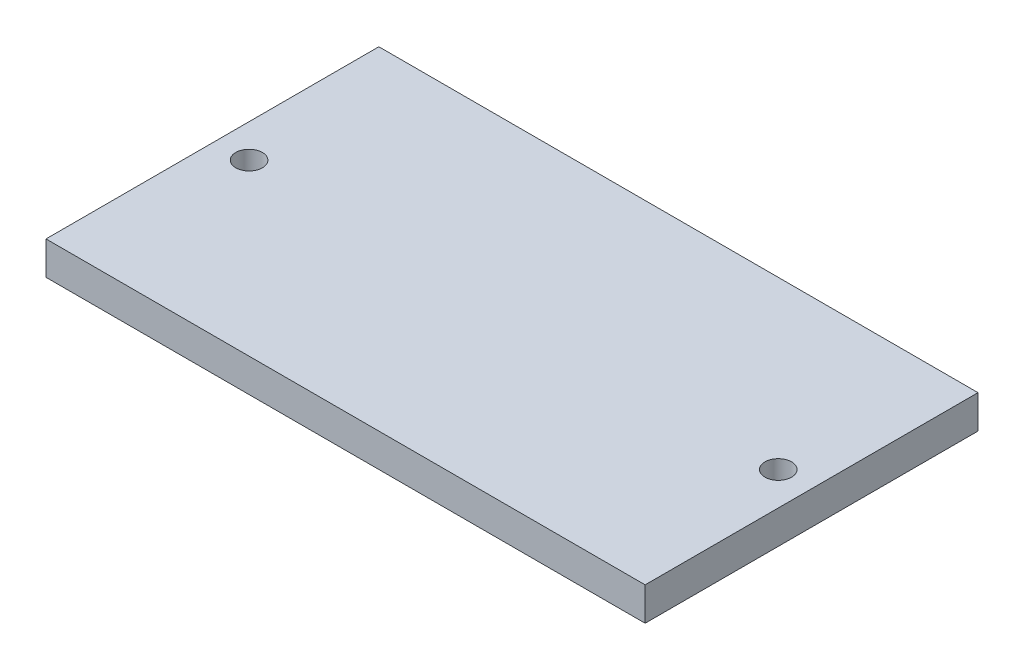
ISO-10303-21;
HEADER;
FILE_DESCRIPTION(('STEP AP214'),'2;1');
FILE_NAME('part.step','',(''),(''),'','','');
FILE_SCHEMA(('AUTOMOTIVE_DESIGN { 1 0 10303 214 1 1 1 1 }'));
ENDSEC;
DATA;
#1=APPLICATION_CONTEXT('core data for automotive mechanical design processes');
#2=APPLICATION_PROTOCOL_DEFINITION('international standard','automotive_design',2000,#1);
#3=PRODUCT_CONTEXT('',#1,'mechanical');
#4=PRODUCT('Part','Part','',(#3));
#5=PRODUCT_RELATED_PRODUCT_CATEGORY('part','',(#4));
#6=PRODUCT_DEFINITION_FORMATION('','',#4);
#7=PRODUCT_DEFINITION_CONTEXT('part definition',#1,'design');
#8=PRODUCT_DEFINITION('design','',#6,#7);
#9=PRODUCT_DEFINITION_SHAPE('','',#8);
#10=(LENGTH_UNIT() NAMED_UNIT(*) SI_UNIT(.MILLI.,.METRE.));
#11=(NAMED_UNIT(*) PLANE_ANGLE_UNIT() SI_UNIT($,.RADIAN.));
#12=(NAMED_UNIT(*) SI_UNIT($,.STERADIAN.) SOLID_ANGLE_UNIT());
#13=UNCERTAINTY_MEASURE_WITH_UNIT(LENGTH_MEASURE(1.E-05),#10,'distance_accuracy_value','');
#14=(GEOMETRIC_REPRESENTATION_CONTEXT(3) GLOBAL_UNCERTAINTY_ASSIGNED_CONTEXT((#13)) GLOBAL_UNIT_ASSIGNED_CONTEXT((#10,
#11,#12)) REPRESENTATION_CONTEXT('',''));
#15=CARTESIAN_POINT('',(0.,0.,0.));
#16=DIRECTION('',(0.,0.,1.));
#17=DIRECTION('',(1.,0.,0.));
#18=AXIS2_PLACEMENT_3D('',#15,#16,#17);
#19=CARTESIAN_POINT('',(0.,5.,0.));
#20=DIRECTION('',(0.,1.,0.));
#21=DIRECTION('',(0.,0.,1.));
#22=AXIS2_PLACEMENT_3D('',#19,#20,#21);
#23=PLANE('',#22);
#24=CARTESIAN_POINT('',(-39.9968748779201,5.,-0.499999999999985));
#25=DIRECTION('',(0.,1.,0.));
#26=DIRECTION('',(0.,0.,1.));
#27=AXIS2_PLACEMENT_3D('',#24,#25,#26);
#28=CIRCLE('',#27,2.);
#29=CARTESIAN_POINT('',(-39.9968748779201,5.,1.50000000000002));
#30=VERTEX_POINT('',#29);
#31=EDGE_CURVE('E112',#30,#30,#28,.T.);
#32=ORIENTED_EDGE('',*,*,#31,.F.);
#33=EDGE_LOOP('',(#32));
#34=FACE_BOUND('',#33,.T.);
#35=DIRECTION('',(0.,0.,1.));
#36=VECTOR('',#35,1.);
#37=CARTESIAN_POINT('',(-45.,5.,25.));
#38=LINE('',#37,#36);
#39=CARTESIAN_POINT('',(-45.,5.,-25.));
#40=VERTEX_POINT('',#39);
#41=CARTESIAN_POINT('',(-45.,5.,25.));
#42=VERTEX_POINT('',#41);
#43=EDGE_CURVE('E92',#40,#42,#38,.T.);
#44=ORIENTED_EDGE('',*,*,#43,.T.);
#45=DIRECTION('',(1.,0.,0.));
#46=VECTOR('',#45,1.);
#47=CARTESIAN_POINT('',(45.,5.,25.));
#48=LINE('',#47,#46);
#49=CARTESIAN_POINT('',(45.,5.,25.));
#50=VERTEX_POINT('',#49);
#51=EDGE_CURVE('E87',#42,#50,#48,.T.);
#52=ORIENTED_EDGE('',*,*,#51,.T.);
#53=DIRECTION('',(0.,0.,-1.));
#54=VECTOR('',#53,1.);
#55=CARTESIAN_POINT('',(45.,5.,25.));
#56=LINE('',#55,#54);
#57=CARTESIAN_POINT('',(45.,5.,-25.));
#58=VERTEX_POINT('',#57);
#59=EDGE_CURVE('E90',#50,#58,#56,.T.);
#60=ORIENTED_EDGE('',*,*,#59,.T.);
#61=DIRECTION('',(-1.,0.,0.));
#62=VECTOR('',#61,1.);
#63=CARTESIAN_POINT('',(45.,5.,-25.));
#64=LINE('',#63,#62);
#65=EDGE_CURVE('E57',#58,#40,#64,.T.);
#66=ORIENTED_EDGE('',*,*,#65,.T.);
#67=EDGE_LOOP('',(#44,#52,#60,#66));
#68=FACE_BOUND('',#67,.T.);
#69=CARTESIAN_POINT('',(40.,5.,0.));
#70=DIRECTION('',(0.,1.,0.));
#71=DIRECTION('',(0.,0.,1.));
#72=AXIS2_PLACEMENT_3D('',#69,#70,#71);
#73=CIRCLE('',#72,2.);
#74=CARTESIAN_POINT('',(40.,5.,2.));
#75=VERTEX_POINT('',#74);
#76=EDGE_CURVE('E134',#75,#75,#73,.T.);
#77=ORIENTED_EDGE('',*,*,#76,.F.);
#78=EDGE_LOOP('',(#77));
#79=FACE_BOUND('',#78,.T.);
#80=ADVANCED_FACE('F39',(#34,#68,#79),#23,.T.);
#81=CARTESIAN_POINT('',(0.,0.,0.));
#82=DIRECTION('',(0.,1.,0.));
#83=DIRECTION('',(0.,0.,1.));
#84=AXIS2_PLACEMENT_3D('',#81,#82,#83);
#85=PLANE('',#84);
#86=DIRECTION('',(0.,0.,1.));
#87=VECTOR('',#86,1.);
#88=CARTESIAN_POINT('',(-45.,0.,25.));
#89=LINE('',#88,#87);
#90=CARTESIAN_POINT('',(-45.,0.,-25.));
#91=VERTEX_POINT('',#90);
#92=CARTESIAN_POINT('',(-45.,0.,25.));
#93=VERTEX_POINT('',#92);
#94=EDGE_CURVE('E108',#91,#93,#89,.T.);
#95=ORIENTED_EDGE('',*,*,#94,.F.);
#96=DIRECTION('',(-1.,0.,0.));
#97=VECTOR('',#96,1.);
#98=CARTESIAN_POINT('',(45.,0.,-25.));
#99=LINE('',#98,#97);
#100=CARTESIAN_POINT('',(45.,0.,-25.));
#101=VERTEX_POINT('',#100);
#102=EDGE_CURVE('E80',#101,#91,#99,.T.);
#103=ORIENTED_EDGE('',*,*,#102,.F.);
#104=DIRECTION('',(0.,0.,-1.));
#105=VECTOR('',#104,1.);
#106=CARTESIAN_POINT('',(45.,0.,25.));
#107=LINE('',#106,#105);
#108=CARTESIAN_POINT('',(45.,0.,25.));
#109=VERTEX_POINT('',#108);
#110=EDGE_CURVE('E74',#109,#101,#107,.T.);
#111=ORIENTED_EDGE('',*,*,#110,.F.);
#112=DIRECTION('',(1.,0.,0.));
#113=VECTOR('',#112,1.);
#114=CARTESIAN_POINT('',(45.,0.,25.));
#115=LINE('',#114,#113);
#116=EDGE_CURVE('E97',#93,#109,#115,.T.);
#117=ORIENTED_EDGE('',*,*,#116,.F.);
#118=EDGE_LOOP('',(#95,#103,#111,#117));
#119=FACE_BOUND('',#118,.T.);
#120=CARTESIAN_POINT('',(-39.9968748779201,0.,-0.499999999999985));
#121=DIRECTION('',(0.,1.,0.));
#122=DIRECTION('',(0.,0.,1.));
#123=AXIS2_PLACEMENT_3D('',#120,#121,#122);
#124=CIRCLE('',#123,2.);
#125=CARTESIAN_POINT('',(-39.9968748779201,0.,1.50000000000002));
#126=VERTEX_POINT('',#125);
#127=EDGE_CURVE('E130',#126,#126,#124,.T.);
#128=ORIENTED_EDGE('',*,*,#127,.T.);
#129=EDGE_LOOP('',(#128));
#130=FACE_BOUND('',#129,.T.);
#131=CARTESIAN_POINT('',(40.,0.,0.));
#132=DIRECTION('',(0.,1.,0.));
#133=DIRECTION('',(0.,0.,1.));
#134=AXIS2_PLACEMENT_3D('',#131,#132,#133);
#135=CIRCLE('',#134,2.);
#136=CARTESIAN_POINT('',(40.,0.,2.));
#137=VERTEX_POINT('',#136);
#138=EDGE_CURVE('E138',#137,#137,#135,.T.);
#139=ORIENTED_EDGE('',*,*,#138,.T.);
#140=EDGE_LOOP('',(#139));
#141=FACE_BOUND('',#140,.T.);
#142=ADVANCED_FACE('F125',(#119,#130,#141),#85,.F.);
#143=CARTESIAN_POINT('',(-45.,5.,25.));
#144=DIRECTION('',(1.,0.,0.));
#145=DIRECTION('',(0.,0.,-1.));
#146=AXIS2_PLACEMENT_3D('',#143,#144,#145);
#147=PLANE('',#146);
#148=ORIENTED_EDGE('',*,*,#94,.T.);
#149=DIRECTION('',(0.,-1.,0.));
#150=VECTOR('',#149,1.);
#151=CARTESIAN_POINT('',(-45.,5.,25.));
#152=LINE('',#151,#150);
#153=EDGE_CURVE('E11',#42,#93,#152,.T.);
#154=ORIENTED_EDGE('',*,*,#153,.F.);
#155=ORIENTED_EDGE('',*,*,#43,.F.);
#156=DIRECTION('',(0.,-1.,0.));
#157=VECTOR('',#156,1.);
#158=CARTESIAN_POINT('',(-45.,5.,-25.));
#159=LINE('',#158,#157);
#160=EDGE_CURVE('E104',#40,#91,#159,.T.);
#161=ORIENTED_EDGE('',*,*,#160,.T.);
#162=EDGE_LOOP('',(#148,#154,#155,#161));
#163=FACE_BOUND('',#162,.T.);
#164=ADVANCED_FACE('F41',(#163),#147,.F.);
#165=CARTESIAN_POINT('',(45.,5.,25.));
#166=DIRECTION('',(0.,0.,-1.));
#167=DIRECTION('',(-1.,0.,0.));
#168=AXIS2_PLACEMENT_3D('',#165,#166,#167);
#169=PLANE('',#168);
#170=ORIENTED_EDGE('',*,*,#116,.T.);
#171=DIRECTION('',(0.,-1.,0.));
#172=VECTOR('',#171,1.);
#173=CARTESIAN_POINT('',(45.,5.,25.));
#174=LINE('',#173,#172);
#175=EDGE_CURVE('E49',#50,#109,#174,.T.);
#176=ORIENTED_EDGE('',*,*,#175,.F.);
#177=ORIENTED_EDGE('',*,*,#51,.F.);
#178=ORIENTED_EDGE('',*,*,#153,.T.);
#179=EDGE_LOOP('',(#170,#176,#177,#178));
#180=FACE_BOUND('',#179,.T.);
#181=ADVANCED_FACE('F96',(#180),#169,.F.);
#182=CARTESIAN_POINT('',(45.,5.,25.));
#183=DIRECTION('',(-1.,0.,0.));
#184=DIRECTION('',(0.,0.,1.));
#185=AXIS2_PLACEMENT_3D('',#182,#183,#184);
#186=PLANE('',#185);
#187=ORIENTED_EDGE('',*,*,#110,.T.);
#188=DIRECTION('',(0.,-1.,0.));
#189=VECTOR('',#188,1.);
#190=CARTESIAN_POINT('',(45.,5.,-25.));
#191=LINE('',#190,#189);
#192=EDGE_CURVE('E99',#58,#101,#191,.T.);
#193=ORIENTED_EDGE('',*,*,#192,.F.);
#194=ORIENTED_EDGE('',*,*,#59,.F.);
#195=ORIENTED_EDGE('',*,*,#175,.T.);
#196=EDGE_LOOP('',(#187,#193,#194,#195));
#197=FACE_BOUND('',#196,.T.);
#198=ADVANCED_FACE('F100',(#197),#186,.F.);
#199=CARTESIAN_POINT('',(45.,5.,-25.));
#200=DIRECTION('',(0.,0.,1.));
#201=DIRECTION('',(1.,0.,0.));
#202=AXIS2_PLACEMENT_3D('',#199,#200,#201);
#203=PLANE('',#202);
#204=ORIENTED_EDGE('',*,*,#102,.T.);
#205=ORIENTED_EDGE('',*,*,#160,.F.);
#206=ORIENTED_EDGE('',*,*,#65,.F.);
#207=ORIENTED_EDGE('',*,*,#192,.T.);
#208=EDGE_LOOP('',(#204,#205,#206,#207));
#209=FACE_BOUND('',#208,.T.);
#210=ADVANCED_FACE('F122',(#209),#203,.F.);
#211=CARTESIAN_POINT('',(-39.9968748779201,5.,-0.499999999999985));
#212=DIRECTION('',(0.,-1.,0.));
#213=DIRECTION('',(0.,0.,-1.));
#214=AXIS2_PLACEMENT_3D('',#211,#212,#213);
#215=CYLINDRICAL_SURFACE('',#214,2.);
#216=ORIENTED_EDGE('',*,*,#31,.T.);
#217=EDGE_LOOP('',(#216));
#218=FACE_BOUND('',#217,.T.);
#219=ORIENTED_EDGE('',*,*,#127,.F.);
#220=EDGE_LOOP('',(#219));
#221=FACE_BOUND('',#220,.T.);
#222=ADVANCED_FACE('F157',(#218,#221),#215,.F.);
#223=CARTESIAN_POINT('',(40.,5.,0.));
#224=DIRECTION('',(0.,-1.,0.));
#225=DIRECTION('',(0.,0.,-1.));
#226=AXIS2_PLACEMENT_3D('',#223,#224,#225);
#227=CYLINDRICAL_SURFACE('',#226,2.);
#228=ORIENTED_EDGE('',*,*,#76,.T.);
#229=EDGE_LOOP('',(#228));
#230=FACE_BOUND('',#229,.T.);
#231=ORIENTED_EDGE('',*,*,#138,.F.);
#232=EDGE_LOOP('',(#231));
#233=FACE_BOUND('',#232,.T.);
#234=ADVANCED_FACE('F146',(#230,#233),#227,.F.);
#235=CLOSED_SHELL('',(#80,#142,#164,#181,#198,#210,#222,#234));
#236=MANIFOLD_SOLID_BREP('B2',#235);
#237=ADVANCED_BREP_SHAPE_REPRESENTATION('',(#18,#236),#14);
#238=SHAPE_DEFINITION_REPRESENTATION(#9,#237);
ENDSEC;
END-ISO-10303-21;
